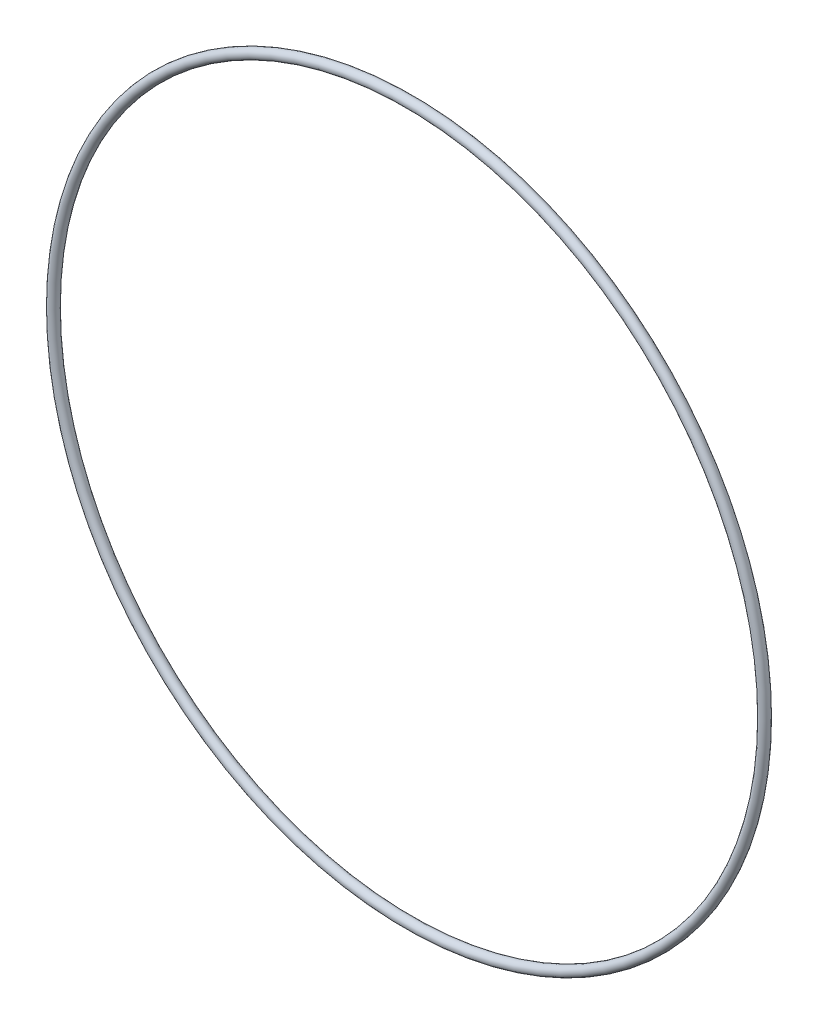
ISO-10303-21;
HEADER;
FILE_DESCRIPTION(('STEP AP214'),'2;1');
FILE_NAME('part.step','',(''),(''),'','','');
FILE_SCHEMA(('AUTOMOTIVE_DESIGN { 1 0 10303 214 1 1 1 1 }'));
ENDSEC;
DATA;
#1=APPLICATION_CONTEXT('core data for automotive mechanical design processes');
#2=APPLICATION_PROTOCOL_DEFINITION('international standard','automotive_design',2000,#1);
#3=PRODUCT_CONTEXT('',#1,'mechanical');
#4=PRODUCT('Part','Part','',(#3));
#5=PRODUCT_RELATED_PRODUCT_CATEGORY('part','',(#4));
#6=PRODUCT_DEFINITION_FORMATION('','',#4);
#7=PRODUCT_DEFINITION_CONTEXT('part definition',#1,'design');
#8=PRODUCT_DEFINITION('design','',#6,#7);
#9=PRODUCT_DEFINITION_SHAPE('','',#8);
#10=(LENGTH_UNIT() NAMED_UNIT(*) SI_UNIT(.MILLI.,.METRE.));
#11=(NAMED_UNIT(*) PLANE_ANGLE_UNIT() SI_UNIT($,.RADIAN.));
#12=(NAMED_UNIT(*) SI_UNIT($,.STERADIAN.) SOLID_ANGLE_UNIT());
#13=UNCERTAINTY_MEASURE_WITH_UNIT(LENGTH_MEASURE(1.E-05),#10,'distance_accuracy_value','');
#14=(GEOMETRIC_REPRESENTATION_CONTEXT(3) GLOBAL_UNCERTAINTY_ASSIGNED_CONTEXT((#13)) GLOBAL_UNIT_ASSIGNED_CONTEXT((#10,
#11,#12)) REPRESENTATION_CONTEXT('',''));
#15=CARTESIAN_POINT('',(0.,0.,0.));
#16=DIRECTION('',(0.,0.,1.));
#17=DIRECTION('',(1.,0.,0.));
#18=AXIS2_PLACEMENT_3D('',#15,#16,#17);
#19=CARTESIAN_POINT('',(0.,0.,0.));
#20=DIRECTION('',(0.,0.,1.));
#21=DIRECTION('',(1.,0.,0.));
#22=AXIS2_PLACEMENT_3D('',#19,#20,#21);
#23=TOROIDAL_SURFACE('',#22,64.2493,0.889000000000003);
#24=CARTESIAN_POINT('',(65.1383,0.,0.));
#25=VERTEX_POINT('',#24);
#26=VERTEX_LOOP('',#25);
#27=FACE_BOUND('',#26,.T.);
#28=ADVANCED_FACE('F37',(#27),#23,.T.);
#29=CLOSED_SHELL('',(#28));
#30=MANIFOLD_SOLID_BREP('B2',#29);
#31=ADVANCED_BREP_SHAPE_REPRESENTATION('',(#18,#30),#14);
#32=SHAPE_DEFINITION_REPRESENTATION(#9,#31);
ENDSEC;
END-ISO-10303-21;
